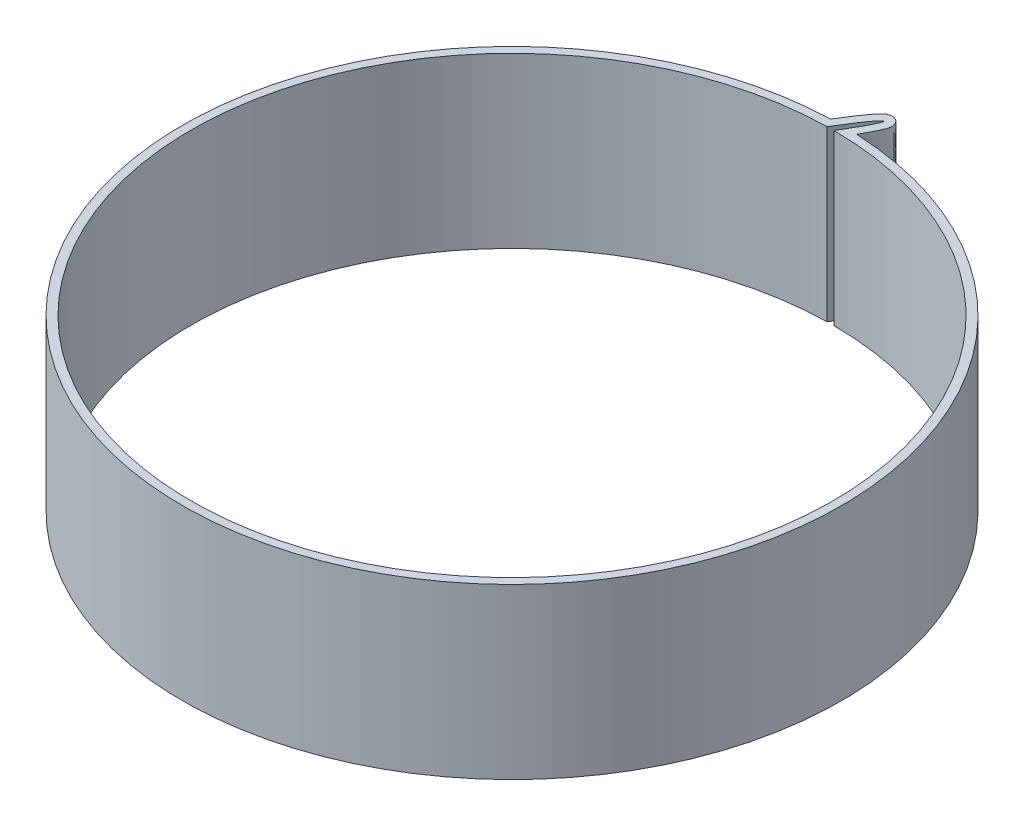
ISO-10303-21;
HEADER;
FILE_DESCRIPTION(('STEP AP214'),'2;1');
FILE_NAME('part.step','',(''),(''),'','','');
FILE_SCHEMA(('AUTOMOTIVE_DESIGN { 1 0 10303 214 1 1 1 1 }'));
ENDSEC;
DATA;
#1=APPLICATION_CONTEXT('core data for automotive mechanical design processes');
#2=APPLICATION_PROTOCOL_DEFINITION('international standard','automotive_design',2000,#1);
#3=PRODUCT_CONTEXT('',#1,'mechanical');
#4=PRODUCT('Part','Part','',(#3));
#5=PRODUCT_RELATED_PRODUCT_CATEGORY('part','',(#4));
#6=PRODUCT_DEFINITION_FORMATION('','',#4);
#7=PRODUCT_DEFINITION_CONTEXT('part definition',#1,'design');
#8=PRODUCT_DEFINITION('design','',#6,#7);
#9=PRODUCT_DEFINITION_SHAPE('','',#8);
#10=(LENGTH_UNIT() NAMED_UNIT(*) SI_UNIT(.MILLI.,.METRE.));
#11=(NAMED_UNIT(*) PLANE_ANGLE_UNIT() SI_UNIT($,.RADIAN.));
#12=(NAMED_UNIT(*) SI_UNIT($,.STERADIAN.) SOLID_ANGLE_UNIT());
#13=UNCERTAINTY_MEASURE_WITH_UNIT(LENGTH_MEASURE(1.E-05),#10,'distance_accuracy_value','');
#14=(GEOMETRIC_REPRESENTATION_CONTEXT(3) GLOBAL_UNCERTAINTY_ASSIGNED_CONTEXT((#13)) GLOBAL_UNIT_ASSIGNED_CONTEXT((#10,
#11,#12)) REPRESENTATION_CONTEXT('',''));
#15=CARTESIAN_POINT('',(0.,0.,0.));
#16=DIRECTION('',(0.,0.,1.));
#17=DIRECTION('',(1.,0.,0.));
#18=AXIS2_PLACEMENT_3D('',#15,#16,#17);
#19=CARTESIAN_POINT('',(4.72756162690545,50.8,-108.965188988417));
#20=DIRECTION('',(0.,-1.,0.));
#21=DIRECTION('',(0.,0.,-1.));
#22=AXIS2_PLACEMENT_3D('',#19,#20,#21);
#23=PLANE('',#22);
#24=CARTESIAN_POINT('',(4.65185682651618,50.8,-98.9507141362083));
#25=CARTESIAN_POINT('',(5.18065080328963,50.8,-99.8738418703975));
#26=CARTESIAN_POINT('',(5.69571373788396,50.8,-100.803541120551));
#27=CARTESIAN_POINT('',(6.43172637878286,50.8,-102.215597598136));
#28=CARTESIAN_POINT('',(6.6709622025829,50.8,-102.689203303906));
#29=CARTESIAN_POINT('',(7.12716684555796,50.8,-103.647071443061));
#30=CARTESIAN_POINT('',(7.34612650472498,50.8,-104.130381083744));
#31=CARTESIAN_POINT('',(7.62855978204937,50.8,-104.877363578717));
#32=CARTESIAN_POINT('',(7.71481837125498,50.8,-105.130131812728));
#33=CARTESIAN_POINT('',(7.85021028655176,50.8,-105.653435996855));
#34=CARTESIAN_POINT('',(7.89739956714897,50.8,-105.92360690526));
#35=CARTESIAN_POINT('',(7.92015624449327,50.8,-106.463552450006));
#36=CARTESIAN_POINT('',(7.89542444579331,50.8,-106.739269692897));
#37=CARTESIAN_POINT('',(7.7999437308732,50.8,-107.131648923145));
#38=CARTESIAN_POINT('',(7.75862485324515,50.8,-107.259764008399));
#39=CARTESIAN_POINT('',(7.65621106161782,50.8,-107.510414721491));
#40=CARTESIAN_POINT('',(7.59449868595236,50.8,-107.633712716341));
#41=CARTESIAN_POINT('',(7.45487690788836,50.8,-107.865940731121));
#42=CARTESIAN_POINT('',(7.37671653418801,50.8,-107.97585743525));
#43=CARTESIAN_POINT('',(7.20373572039032,50.8,-108.183325112222));
#44=CARTESIAN_POINT('',(7.10804841641292,50.8,-108.281606930126));
#45=CARTESIAN_POINT('',(6.8008795094777,50.8,-108.551102211273));
#46=CARTESIAN_POINT('',(6.57233382204394,50.8,-108.696099787098));
#47=CARTESIAN_POINT('',(6.0702724640452,50.8,-108.91379013411));
#48=CARTESIAN_POINT('',(5.80881661314685,50.8,-108.98144553323));
#49=CARTESIAN_POINT('',(5.26536946249543,50.8,-109.035620930206));
#50=CARTESIAN_POINT('',(4.99395224542545,50.8,-109.020497965223));
#51=CARTESIAN_POINT('',(4.59436631764575,50.8,-108.937534500015));
#52=CARTESIAN_POINT('',(4.46233772762722,50.8,-108.899569638896));
#53=CARTESIAN_POINT('',(4.20808715971646,50.8,-108.806291114709));
#54=CARTESIAN_POINT('',(4.08479098153585,50.8,-108.750767308694));
#55=CARTESIAN_POINT('',(3.84529262565935,50.8,-108.623259728569));
#56=CARTESIAN_POINT('',(3.72859936452076,50.8,-108.550802782041));
#57=CARTESIAN_POINT('',(3.50657674417966,50.8,-108.394970888986));
#58=CARTESIAN_POINT('',(3.40059469160127,50.8,-108.31136006801));
#59=CARTESIAN_POINT('',(3.09375981544888,50.8,-108.047945757278));
#60=CARTESIAN_POINT('',(2.90358880785588,50.8,-107.856046724635));
#61=CARTESIAN_POINT('',(2.53631795650084,50.8,-107.457447540981));
#62=CARTESIAN_POINT('',(2.36030333336747,50.8,-107.251525150618));
#63=CARTESIAN_POINT('',(1.84554409364799,50.8,-106.625759578111));
#64=CARTESIAN_POINT('',(1.51875662704767,50.8,-106.19679650067));
#65=CARTESIAN_POINT('',(0.878997109584093,50.8,-105.328932883738));
#66=CARTESIAN_POINT('',(0.566714406832962,50.8,-104.88953649448));
#67=CARTESIAN_POINT('',(-0.355847923495889,50.8,-103.561071531993));
#68=CARTESIAN_POINT('',(-0.952038685141566,50.8,-102.66183441853));
#69=CARTESIAN_POINT('',(-2.12022979026895,50.8,-100.846098960397));
#70=CARTESIAN_POINT('',(-2.69130808583355,50.8,-99.9301050487255));
#71=CARTESIAN_POINT('',(-3.25044622628706,50.8,-99.0066573485341));
#72=B_SPLINE_CURVE_WITH_KNOTS('',3,(#24,#25,#26,#27,#28,#29,#30,#31,#32,#33,#34,#35,#36,#37,#38,
#39,#40,#41,#42,#43,#44,#45,#46,#47,#48,#49,#50,#51,#52,#53,#54,#55,#56,#57,#58,#59,#60,#61,#62,
#63,#64,#65,#66,#67,#68,#69,#70,#71),.UNSPECIFIED.,.F.,.F.,(4,2,2,2,2,2,2,2,2,2,2,2,2,2,2,2,2,2,
2,2,2,2,2,4),(0.,0.124999999999999,0.187499999999998,0.249999999999997,0.281249999999996,
0.312499999999996,0.343749999999995,0.359374999999995,0.374999999999995,0.390624999999994,
0.406249999999994,0.437499999999993,0.468749999999993,0.499999999999992,0.515624999999992,
0.531249999999992,0.546874999999991,0.562499999999991,0.593749999999992,0.624999999999992,
0.687499999999994,0.749999999999995,0.874999999999997,1.),.UNSPECIFIED.);
#73=CARTESIAN_POINT('',(4.65185682651618,50.8,-98.9507141362083));
#74=VERTEX_POINT('',#73);
#75=CARTESIAN_POINT('',(-3.25044622628707,50.8,-99.0066573485341));
#76=VERTEX_POINT('',#75);
#77=EDGE_CURVE('E131',#74,#76,#72,.T.);
#78=ORIENTED_EDGE('',*,*,#77,.T.);
#79=CARTESIAN_POINT('',(0.,50.8,0.));
#80=DIRECTION('',(0.,1.,0.));
#81=DIRECTION('',(1.,0.,0.));
#82=AXIS2_PLACEMENT_3D('',#79,#80,#81);
#83=CIRCLE('',#82,99.0600000000001);
#84=EDGE_CURVE('E135',#76,#74,#83,.T.);
#85=ORIENTED_EDGE('',*,*,#84,.T.);
#86=EDGE_LOOP('',(#78,#85));
#87=FACE_BOUND('',#86,.T.);
#88=CARTESIAN_POINT('',(0.,50.8,-97.79));
#89=DIRECTION('',(0.,1.,0.));
#90=DIRECTION('',(0.522589944647209,0.,-0.852584159924184));
#91=AXIS2_PLACEMENT_3D('',#88,#89,#90);
#92=ELLIPSE('',#91,10.1804826912174,0.868888816464492);
#93=CARTESIAN_POINT('',(0.235964264490888,50.8,-96.5197115664251));
#94=VERTEX_POINT('',#93);
#95=CARTESIAN_POINT('',(-1.78722722994291,50.8,-96.5034518492917));
#96=VERTEX_POINT('',#95);
#97=EDGE_CURVE('E98',#94,#96,#92,.T.);
#98=ORIENTED_EDGE('',*,*,#97,.F.);
#99=CARTESIAN_POINT('',(0.,50.8,0.));
#100=DIRECTION('',(0.,1.,0.));
#101=DIRECTION('',(0.,0.,-1.));
#102=AXIS2_PLACEMENT_3D('',#99,#100,#101);
#103=CIRCLE('',#102,96.5200000000001);
#104=EDGE_CURVE('E92',#96,#94,#103,.T.);
#105=ORIENTED_EDGE('',*,*,#104,.F.);
#106=EDGE_LOOP('',(#98,#105));
#107=FACE_BOUND('',#106,.T.);
#108=ADVANCED_FACE('F51',(#87,#107),#23,.F.);
#109=CARTESIAN_POINT('',(4.72756162690545,0.,-108.965188988417));
#110=DIRECTION('',(0.,-1.,0.));
#111=DIRECTION('',(0.,0.,-1.));
#112=AXIS2_PLACEMENT_3D('',#109,#110,#111);
#113=PLANE('',#112);
#114=CARTESIAN_POINT('',(4.65185682651618,0.,-98.9507141362083));
#115=CARTESIAN_POINT('',(5.18065080328963,0.,-99.8738418703975));
#116=CARTESIAN_POINT('',(5.69571373788396,0.,-100.803541120551));
#117=CARTESIAN_POINT('',(6.43172637878286,0.,-102.215597598136));
#118=CARTESIAN_POINT('',(6.6709622025829,0.,-102.689203303906));
#119=CARTESIAN_POINT('',(7.12716684555796,0.,-103.647071443061));
#120=CARTESIAN_POINT('',(7.34612650472498,0.,-104.130381083744));
#121=CARTESIAN_POINT('',(7.62855978204937,0.,-104.877363578717));
#122=CARTESIAN_POINT('',(7.71481837125498,0.,-105.130131812728));
#123=CARTESIAN_POINT('',(7.85021028655176,0.,-105.653435996855));
#124=CARTESIAN_POINT('',(7.89739956714897,0.,-105.92360690526));
#125=CARTESIAN_POINT('',(7.92015624449327,0.,-106.463552450006));
#126=CARTESIAN_POINT('',(7.89542444579331,0.,-106.739269692897));
#127=CARTESIAN_POINT('',(7.7999437308732,0.,-107.131648923145));
#128=CARTESIAN_POINT('',(7.75862485324515,0.,-107.259764008399));
#129=CARTESIAN_POINT('',(7.65621106161782,0.,-107.510414721491));
#130=CARTESIAN_POINT('',(7.59449868595236,0.,-107.633712716341));
#131=CARTESIAN_POINT('',(7.45487690788836,0.,-107.865940731121));
#132=CARTESIAN_POINT('',(7.37671653418801,0.,-107.97585743525));
#133=CARTESIAN_POINT('',(7.20373572039032,0.,-108.183325112222));
#134=CARTESIAN_POINT('',(7.10804841641292,0.,-108.281606930126));
#135=CARTESIAN_POINT('',(6.8008795094777,0.,-108.551102211273));
#136=CARTESIAN_POINT('',(6.57233382204394,0.,-108.696099787098));
#137=CARTESIAN_POINT('',(6.0702724640452,0.,-108.91379013411));
#138=CARTESIAN_POINT('',(5.80881661314685,0.,-108.98144553323));
#139=CARTESIAN_POINT('',(5.26536946249543,0.,-109.035620930206));
#140=CARTESIAN_POINT('',(4.99395224542545,0.,-109.020497965223));
#141=CARTESIAN_POINT('',(4.59436631764575,0.,-108.937534500015));
#142=CARTESIAN_POINT('',(4.46233772762722,0.,-108.899569638896));
#143=CARTESIAN_POINT('',(4.20808715971646,0.,-108.806291114709));
#144=CARTESIAN_POINT('',(4.08479098153585,0.,-108.750767308694));
#145=CARTESIAN_POINT('',(3.84529262565935,0.,-108.623259728569));
#146=CARTESIAN_POINT('',(3.72859936452076,0.,-108.550802782041));
#147=CARTESIAN_POINT('',(3.50657674417966,0.,-108.394970888986));
#148=CARTESIAN_POINT('',(3.40059469160127,0.,-108.31136006801));
#149=CARTESIAN_POINT('',(3.09375981544888,0.,-108.047945757278));
#150=CARTESIAN_POINT('',(2.90358880785588,0.,-107.856046724635));
#151=CARTESIAN_POINT('',(2.53631795650084,0.,-107.457447540981));
#152=CARTESIAN_POINT('',(2.36030333336747,0.,-107.251525150618));
#153=CARTESIAN_POINT('',(1.84554409364799,0.,-106.625759578111));
#154=CARTESIAN_POINT('',(1.51875662704767,0.,-106.19679650067));
#155=CARTESIAN_POINT('',(0.878997109584093,0.,-105.328932883738));
#156=CARTESIAN_POINT('',(0.566714406832962,0.,-104.88953649448));
#157=CARTESIAN_POINT('',(-0.355847923495889,0.,-103.561071531993));
#158=CARTESIAN_POINT('',(-0.952038685141566,0.,-102.66183441853));
#159=CARTESIAN_POINT('',(-2.12022979026895,0.,-100.846098960397));
#160=CARTESIAN_POINT('',(-2.69130808583355,0.,-99.9301050487255));
#161=CARTESIAN_POINT('',(-3.25044622628706,0.,-99.0066573485341));
#162=B_SPLINE_CURVE_WITH_KNOTS('',3,(#114,#115,#116,#117,#118,#119,#120,#121,#122,#123,#124,
#125,#126,#127,#128,#129,#130,#131,#132,#133,#134,#135,#136,#137,#138,#139,#140,#141,#142,#143,
#144,#145,#146,#147,#148,#149,#150,#151,#152,#153,#154,#155,#156,#157,#158,#159,#160,#161),
.UNSPECIFIED.,.F.,.F.,(4,2,2,2,2,2,2,2,2,2,2,2,2,2,2,2,2,2,2,2,2,2,2,4),(0.,0.124999999999999,
0.187499999999998,0.249999999999997,0.281249999999996,0.312499999999996,0.343749999999995,
0.359374999999995,0.374999999999995,0.390624999999994,0.406249999999994,0.437499999999993,
0.468749999999993,0.499999999999992,0.515624999999992,0.531249999999992,0.546874999999991,
0.562499999999991,0.593749999999992,0.624999999999992,0.687499999999994,0.749999999999995,
0.874999999999997,1.),.UNSPECIFIED.);
#163=CARTESIAN_POINT('',(4.65185682651618,0.,-98.9507141362083));
#164=VERTEX_POINT('',#163);
#165=CARTESIAN_POINT('',(-3.25044622628707,0.,-99.0066573485341));
#166=VERTEX_POINT('',#165);
#167=EDGE_CURVE('E132',#164,#166,#162,.T.);
#168=ORIENTED_EDGE('',*,*,#167,.F.);
#169=CARTESIAN_POINT('',(0.,0.,0.));
#170=DIRECTION('',(0.,1.,0.));
#171=DIRECTION('',(1.,0.,0.));
#172=AXIS2_PLACEMENT_3D('',#169,#170,#171);
#173=CIRCLE('',#172,99.0600000000001);
#174=EDGE_CURVE('E125',#166,#164,#173,.T.);
#175=ORIENTED_EDGE('',*,*,#174,.F.);
#176=EDGE_LOOP('',(#168,#175));
#177=FACE_BOUND('',#176,.T.);
#178=CARTESIAN_POINT('',(0.,0.,0.));
#179=DIRECTION('',(0.,1.,0.));
#180=DIRECTION('',(0.,0.,-1.));
#181=AXIS2_PLACEMENT_3D('',#178,#179,#180);
#182=CIRCLE('',#181,96.5200000000001);
#183=CARTESIAN_POINT('',(-1.78722722994291,0.,-96.5034518492917));
#184=VERTEX_POINT('',#183);
#185=CARTESIAN_POINT('',(0.235964264490888,0.,-96.5197115664251));
#186=VERTEX_POINT('',#185);
#187=EDGE_CURVE('E102',#184,#186,#182,.T.);
#188=ORIENTED_EDGE('',*,*,#187,.T.);
#189=CARTESIAN_POINT('',(0.,0.,-97.79));
#190=DIRECTION('',(0.,1.,0.));
#191=DIRECTION('',(0.522589944647209,0.,-0.852584159924184));
#192=AXIS2_PLACEMENT_3D('',#189,#190,#191);
#193=ELLIPSE('',#192,10.1804826912174,0.868888816464492);
#194=EDGE_CURVE('E74',#186,#184,#193,.T.);
#195=ORIENTED_EDGE('',*,*,#194,.T.);
#196=EDGE_LOOP('',(#188,#195));
#197=FACE_BOUND('',#196,.T.);
#198=ADVANCED_FACE('F114',(#177,#197),#113,.T.);
#199=DIRECTION('',(0.,-1.,0.));
#200=VECTOR('',#199,1.);
#201=SURFACE_OF_LINEAR_EXTRUSION('',#72,#200);
#202=ORIENTED_EDGE('',*,*,#167,.T.);
#203=DIRECTION('',(0.,-1.,0.));
#204=VECTOR('',#203,1.);
#205=CARTESIAN_POINT('',(-3.25044622628707,50.8,-99.0066573485341));
#206=LINE('',#205,#204);
#207=EDGE_CURVE('E12',#76,#166,#206,.T.);
#208=ORIENTED_EDGE('',*,*,#207,.F.);
#209=ORIENTED_EDGE('',*,*,#77,.F.);
#210=DIRECTION('',(0.,-1.,0.));
#211=VECTOR('',#210,1.);
#212=CARTESIAN_POINT('',(4.65185682651618,50.8,-98.9507141362083));
#213=LINE('',#212,#211);
#214=EDGE_CURVE('E60',#74,#164,#213,.T.);
#215=ORIENTED_EDGE('',*,*,#214,.T.);
#216=EDGE_LOOP('',(#202,#208,#209,#215));
#217=FACE_BOUND('',#216,.T.);
#218=ADVANCED_FACE('F53',(#217),#201,.F.);
#219=CARTESIAN_POINT('',(0.,50.8,0.));
#220=DIRECTION('',(0.,-1.,0.));
#221=DIRECTION('',(0.,0.,-1.));
#222=AXIS2_PLACEMENT_3D('',#219,#220,#221);
#223=CYLINDRICAL_SURFACE('',#222,99.0600000000001);
#224=ORIENTED_EDGE('',*,*,#174,.T.);
#225=ORIENTED_EDGE('',*,*,#214,.F.);
#226=ORIENTED_EDGE('',*,*,#84,.F.);
#227=ORIENTED_EDGE('',*,*,#207,.T.);
#228=EDGE_LOOP('',(#224,#225,#226,#227));
#229=FACE_BOUND('',#228,.T.);
#230=ADVANCED_FACE('F111',(#229),#223,.T.);
#231=DIRECTION('',(0.,-1.,0.));
#232=VECTOR('',#231,1.);
#233=SURFACE_OF_LINEAR_EXTRUSION('',#92,#232);
#234=ORIENTED_EDGE('',*,*,#194,.F.);
#235=DIRECTION('',(0.,-1.,0.));
#236=VECTOR('',#235,1.);
#237=CARTESIAN_POINT('',(0.235964264490888,50.8,-96.5197115664251));
#238=LINE('',#237,#236);
#239=EDGE_CURVE('E94',#94,#186,#238,.T.);
#240=ORIENTED_EDGE('',*,*,#239,.F.);
#241=ORIENTED_EDGE('',*,*,#97,.T.);
#242=DIRECTION('',(0.,-1.,0.));
#243=VECTOR('',#242,1.);
#244=CARTESIAN_POINT('',(-1.78722722994291,50.8,-96.5034518492917));
#245=LINE('',#244,#243);
#246=EDGE_CURVE('E67',#96,#184,#245,.T.);
#247=ORIENTED_EDGE('',*,*,#246,.T.);
#248=EDGE_LOOP('',(#234,#240,#241,#247));
#249=FACE_BOUND('',#248,.T.);
#250=ADVANCED_FACE('F100',(#249),#233,.T.);
#251=CARTESIAN_POINT('',(0.,50.8,0.));
#252=DIRECTION('',(0.,-1.,0.));
#253=DIRECTION('',(0.,0.,-1.));
#254=AXIS2_PLACEMENT_3D('',#251,#252,#253);
#255=CYLINDRICAL_SURFACE('',#254,96.5200000000001);
#256=ORIENTED_EDGE('',*,*,#187,.F.);
#257=ORIENTED_EDGE('',*,*,#246,.F.);
#258=ORIENTED_EDGE('',*,*,#104,.T.);
#259=ORIENTED_EDGE('',*,*,#239,.T.);
#260=EDGE_LOOP('',(#256,#257,#258,#259));
#261=FACE_BOUND('',#260,.T.);
#262=ADVANCED_FACE('F93',(#261),#255,.F.);
#263=CLOSED_SHELL('',(#108,#198,#218,#230,#250,#262));
#264=MANIFOLD_SOLID_BREP('B2',#263);
#265=ADVANCED_BREP_SHAPE_REPRESENTATION('',(#18,#264),#14);
#266=SHAPE_DEFINITION_REPRESENTATION(#9,#265);
ENDSEC;
END-ISO-10303-21;
